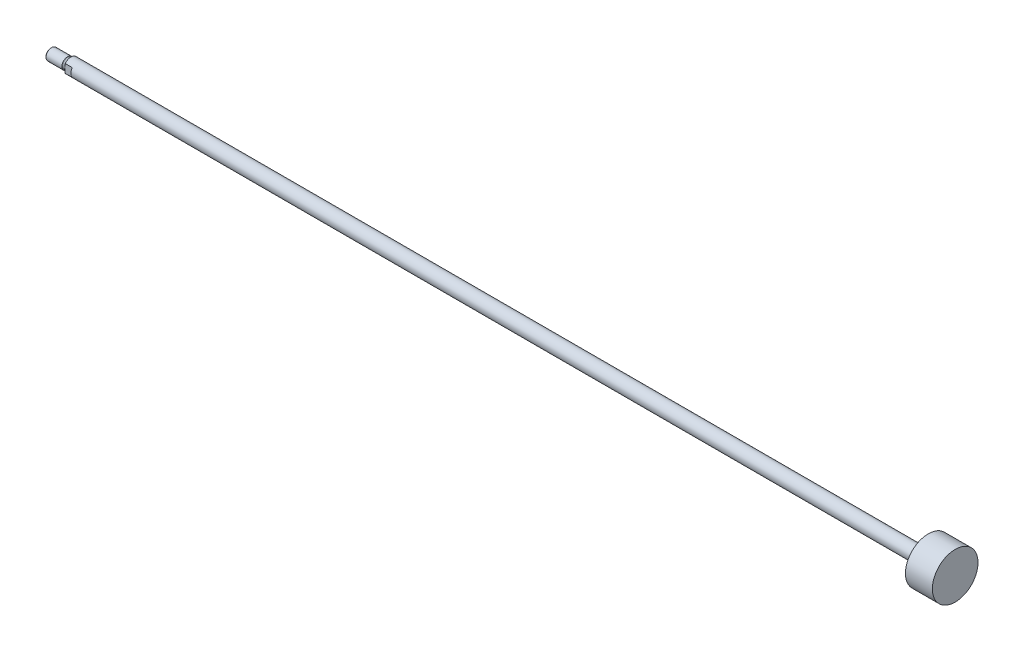
ISO-10303-21;
HEADER;
FILE_DESCRIPTION(('STEP AP214'),'2;1');
FILE_NAME('part.step','',(''),(''),'','','');
FILE_SCHEMA(('AUTOMOTIVE_DESIGN { 1 0 10303 214 1 1 1 1 }'));
ENDSEC;
DATA;
#1=APPLICATION_CONTEXT('core data for automotive mechanical design processes');
#2=APPLICATION_PROTOCOL_DEFINITION('international standard','automotive_design',2000,#1);
#3=PRODUCT_CONTEXT('',#1,'mechanical');
#4=PRODUCT('Part','Part','',(#3));
#5=PRODUCT_RELATED_PRODUCT_CATEGORY('part','',(#4));
#6=PRODUCT_DEFINITION_FORMATION('','',#4);
#7=PRODUCT_DEFINITION_CONTEXT('part definition',#1,'design');
#8=PRODUCT_DEFINITION('design','',#6,#7);
#9=PRODUCT_DEFINITION_SHAPE('','',#8);
#10=(LENGTH_UNIT() NAMED_UNIT(*) SI_UNIT(.MILLI.,.METRE.));
#11=(NAMED_UNIT(*) PLANE_ANGLE_UNIT() SI_UNIT($,.RADIAN.));
#12=(NAMED_UNIT(*) SI_UNIT($,.STERADIAN.) SOLID_ANGLE_UNIT());
#13=UNCERTAINTY_MEASURE_WITH_UNIT(LENGTH_MEASURE(1.E-05),#10,'distance_accuracy_value','');
#14=(GEOMETRIC_REPRESENTATION_CONTEXT(3) GLOBAL_UNCERTAINTY_ASSIGNED_CONTEXT((#13)) GLOBAL_UNIT_ASSIGNED_CONTEXT((#10,
#11,#12)) REPRESENTATION_CONTEXT('',''));
#15=CARTESIAN_POINT('',(0.,0.,0.));
#16=DIRECTION('',(0.,0.,1.));
#17=DIRECTION('',(1.,0.,0.));
#18=AXIS2_PLACEMENT_3D('',#15,#16,#17);
#19=CARTESIAN_POINT('',(-504.7615,0.,0.));
#20=DIRECTION('',(1.,0.,0.));
#21=DIRECTION('',(0.,0.,-1.));
#22=AXIS2_PLACEMENT_3D('',#19,#20,#21);
#23=PLANE('',#22);
#24=CARTESIAN_POINT('',(-504.761500000029,0.,0.));
#25=DIRECTION('',(1.,0.,0.));
#26=DIRECTION('',(0.,0.,-1.));
#27=AXIS2_PLACEMENT_3D('',#24,#25,#26);
#28=CIRCLE('',#27,5.59435000008079);
#29=CARTESIAN_POINT('',(-504.761500000029,0.,-5.59435000008079));
#30=VERTEX_POINT('',#29);
#31=EDGE_CURVE('E19',#30,#30,#28,.T.);
#32=ORIENTED_EDGE('',*,*,#31,.F.);
#33=EDGE_LOOP('',(#32));
#34=FACE_BOUND('',#33,.T.);
#35=ADVANCED_FACE('F16',(#34),#23,.F.);
#36=CARTESIAN_POINT('',(-504.005850000055,0.,0.));
#37=DIRECTION('',(1.,0.,0.));
#38=DIRECTION('',(0.,0.,-1.));
#39=AXIS2_PLACEMENT_3D('',#36,#37,#38);
#40=CONICAL_SURFACE('',#39,6.35000000005448,0.785398163397448);
#41=ORIENTED_EDGE('',*,*,#31,.T.);
#42=EDGE_LOOP('',(#41));
#43=FACE_BOUND('',#42,.T.);
#44=CARTESIAN_POINT('',(-504.00585,0.,0.));
#45=DIRECTION('',(-1.,0.,0.));
#46=DIRECTION('',(0.,0.,1.));
#47=AXIS2_PLACEMENT_3D('',#44,#45,#46);
#48=CIRCLE('',#47,6.35);
#49=CARTESIAN_POINT('',(-504.00585,0.,6.35));
#50=VERTEX_POINT('',#49);
#51=EDGE_CURVE('E250',#50,#50,#48,.F.);
#52=ORIENTED_EDGE('',*,*,#51,.F.);
#53=EDGE_LOOP('',(#52));
#54=FACE_BOUND('',#53,.T.);
#55=ADVANCED_FACE('F171',(#43,#54),#40,.T.);
#56=CARTESIAN_POINT('',(-482.5365,0.,0.));
#57=DIRECTION('',(-1.,0.,0.));
#58=DIRECTION('',(0.,0.,1.));
#59=AXIS2_PLACEMENT_3D('',#56,#57,#58);
#60=CYLINDRICAL_SURFACE('',#59,6.35);
#61=ORIENTED_EDGE('',*,*,#51,.T.);
#62=EDGE_LOOP('',(#61));
#63=FACE_BOUND('',#62,.T.);
#64=CARTESIAN_POINT('',(-486.244899999974,0.,0.));
#65=DIRECTION('',(-1.,0.,0.));
#66=DIRECTION('',(0.,0.,1.));
#67=AXIS2_PLACEMENT_3D('',#64,#65,#66);
#68=CIRCLE('',#67,6.35000000005448);
#69=CARTESIAN_POINT('',(-486.244899999974,0.,6.35000000005448));
#70=VERTEX_POINT('',#69);
#71=EDGE_CURVE('E238',#70,#70,#68,.F.);
#72=ORIENTED_EDGE('',*,*,#71,.F.);
#73=EDGE_LOOP('',(#72));
#74=FACE_BOUND('',#73,.T.);
#75=ADVANCED_FACE('F168',(#63,#74),#60,.T.);
#76=CARTESIAN_POINT('',(-486.244899999974,0.,0.));
#77=DIRECTION('',(-1.,0.,0.));
#78=DIRECTION('',(0.,0.,1.));
#79=AXIS2_PLACEMENT_3D('',#76,#77,#78);
#80=CONICAL_SURFACE('',#79,6.35000000005448,0.785398163397448);
#81=CARTESIAN_POINT('',(-485.737866704261,0.,0.));
#82=DIRECTION('',(1.,0.,0.));
#83=DIRECTION('',(0.,0.,-1.));
#84=AXIS2_PLACEMENT_3D('',#81,#82,#83);
#85=CIRCLE('',#84,5.84296670426101);
#86=CARTESIAN_POINT('',(-485.737866704261,0.,-5.84296670426101));
#87=VERTEX_POINT('',#86);
#88=EDGE_CURVE('E155',#87,#87,#85,.F.);
#89=ORIENTED_EDGE('',*,*,#88,.T.);
#90=EDGE_LOOP('',(#89));
#91=FACE_BOUND('',#90,.T.);
#92=ORIENTED_EDGE('',*,*,#71,.T.);
#93=EDGE_LOOP('',(#92));
#94=FACE_BOUND('',#93,.T.);
#95=ADVANCED_FACE('F163',(#91,#94),#80,.T.);
#96=CARTESIAN_POINT('',(-484.570433408522,0.,0.));
#97=DIRECTION('',(1.,0.,0.));
#98=DIRECTION('',(0.,0.,-1.));
#99=AXIS2_PLACEMENT_3D('',#96,#97,#98);
#100=TOROIDAL_SURFACE('',#99,7.01040000000001,1.65100000000001);
#101=ORIENTED_EDGE('',*,*,#88,.F.);
#102=EDGE_LOOP('',(#101));
#103=FACE_BOUND('',#102,.T.);
#104=CARTESIAN_POINT('',(-484.570433408522,0.,0.));
#105=DIRECTION('',(-1.,0.,0.));
#106=DIRECTION('',(0.,0.,1.));
#107=AXIS2_PLACEMENT_3D('',#104,#105,#106);
#108=CIRCLE('',#107,5.3594);
#109=CARTESIAN_POINT('',(-484.570433408522,0.,5.3594));
#110=VERTEX_POINT('',#109);
#111=EDGE_CURVE('E231',#110,#110,#108,.F.);
#112=ORIENTED_EDGE('',*,*,#111,.F.);
#113=EDGE_LOOP('',(#112));
#114=FACE_BOUND('',#113,.T.);
#115=ADVANCED_FACE('F158',(#103,#114),#100,.F.);
#116=CARTESIAN_POINT('',(504.7615,25.52065,0.));
#117=DIRECTION('',(-1.,0.,0.));
#118=DIRECTION('',(0.,0.,1.));
#119=AXIS2_PLACEMENT_3D('',#116,#117,#118);
#120=PLANE('',#119);
#121=CARTESIAN_POINT('',(504.7615,0.,0.));
#122=DIRECTION('',(-1.,0.,0.));
#123=DIRECTION('',(0.,0.,1.));
#124=AXIS2_PLACEMENT_3D('',#121,#122,#123);
#125=CIRCLE('',#124,25.52065);
#126=CARTESIAN_POINT('',(504.7615,0.,25.52065));
#127=VERTEX_POINT('',#126);
#128=EDGE_CURVE('E229',#127,#127,#125,.T.);
#129=ORIENTED_EDGE('',*,*,#128,.F.);
#130=EDGE_LOOP('',(#129));
#131=FACE_BOUND('',#130,.T.);
#132=ADVANCED_FACE('F162',(#131),#120,.F.);
#133=CARTESIAN_POINT('',(-482.5365,0.,0.));
#134=DIRECTION('',(-1.,0.,0.));
#135=DIRECTION('',(0.,0.,1.));
#136=AXIS2_PLACEMENT_3D('',#133,#134,#135);
#137=CYLINDRICAL_SURFACE('',#136,5.3594);
#138=ORIENTED_EDGE('',*,*,#111,.T.);
#139=EDGE_LOOP('',(#138));
#140=FACE_BOUND('',#139,.T.);
#141=CARTESIAN_POINT('',(-484.1875,0.,0.));
#142=DIRECTION('',(1.,0.,0.));
#143=DIRECTION('',(0.,0.,-1.));
#144=AXIS2_PLACEMENT_3D('',#141,#142,#143);
#145=CIRCLE('',#144,5.3594);
#146=CARTESIAN_POINT('',(-484.1875,0.,-5.3594));
#147=VERTEX_POINT('',#146);
#148=EDGE_CURVE('E115',#147,#147,#145,.F.);
#149=ORIENTED_EDGE('',*,*,#148,.T.);
#150=EDGE_LOOP('',(#149));
#151=FACE_BOUND('',#150,.T.);
#152=ADVANCED_FACE('F266',(#140,#151),#137,.T.);
#153=CARTESIAN_POINT('',(504.7615,0.,0.));
#154=DIRECTION('',(-1.,0.,0.));
#155=DIRECTION('',(0.,0.,1.));
#156=AXIS2_PLACEMENT_3D('',#153,#154,#155);
#157=CYLINDRICAL_SURFACE('',#156,25.52065);
#158=CARTESIAN_POINT('',(474.7133,0.,0.));
#159=DIRECTION('',(-1.,0.,0.));
#160=DIRECTION('',(0.,0.,1.));
#161=AXIS2_PLACEMENT_3D('',#158,#159,#160);
#162=CIRCLE('',#161,25.52065);
#163=CARTESIAN_POINT('',(474.7133,0.,25.52065));
#164=VERTEX_POINT('',#163);
#165=EDGE_CURVE('E227',#164,#164,#162,.F.);
#166=ORIENTED_EDGE('',*,*,#165,.T.);
#167=EDGE_LOOP('',(#166));
#168=FACE_BOUND('',#167,.T.);
#169=ORIENTED_EDGE('',*,*,#128,.T.);
#170=EDGE_LOOP('',(#169));
#171=FACE_BOUND('',#170,.T.);
#172=ADVANCED_FACE('F264',(#168,#171),#157,.T.);
#173=CARTESIAN_POINT('',(-482.5365,0.,0.));
#174=DIRECTION('',(1.,0.,0.));
#175=DIRECTION('',(0.,0.,-1.));
#176=AXIS2_PLACEMENT_3D('',#173,#174,#175);
#177=PLANE('',#176);
#178=DIRECTION('',(0.,1.,0.));
#179=VECTOR('',#178,1.);
#180=CARTESIAN_POINT('',(-482.5365,7.9375,6.35));
#181=LINE('',#180,#179);
#182=CARTESIAN_POINT('',(-482.5365,2.97038855370808,6.35));
#183=VERTEX_POINT('',#182);
#184=CARTESIAN_POINT('',(-482.5365,4.7625,6.35));
#185=VERTEX_POINT('',#184);
#186=EDGE_CURVE('E91',#183,#185,#181,.T.);
#187=ORIENTED_EDGE('',*,*,#186,.T.);
#188=CARTESIAN_POINT('',(-482.5365,0.,0.));
#189=DIRECTION('',(-1.,0.,0.));
#190=DIRECTION('',(0.,0.,1.));
#191=AXIS2_PLACEMENT_3D('',#188,#189,#190);
#192=CIRCLE('',#191,7.9375);
#193=CARTESIAN_POINT('',(-482.5365,4.7625,-6.35));
#194=VERTEX_POINT('',#193);
#195=EDGE_CURVE('E61',#194,#185,#192,.F.);
#196=ORIENTED_EDGE('',*,*,#195,.F.);
#197=DIRECTION('',(0.,1.,0.));
#198=VECTOR('',#197,1.);
#199=CARTESIAN_POINT('',(-482.5365,-7.9375,-6.35));
#200=LINE('',#199,#198);
#201=CARTESIAN_POINT('',(-482.5365,2.97038855370802,-6.35));
#202=VERTEX_POINT('',#201);
#203=EDGE_CURVE('E83',#194,#202,#200,.F.);
#204=ORIENTED_EDGE('',*,*,#203,.T.);
#205=CARTESIAN_POINT('',(-482.5365,0.,0.));
#206=DIRECTION('',(-1.,0.,0.));
#207=DIRECTION('',(0.,0.423711707421557,0.905797101449276));
#208=AXIS2_PLACEMENT_3D('',#205,#206,#207);
#209=CIRCLE('',#208,7.01039999999997);
#210=EDGE_CURVE('E78',#202,#183,#209,.F.);
#211=ORIENTED_EDGE('',*,*,#210,.T.);
#212=EDGE_LOOP('',(#187,#196,#204,#211));
#213=FACE_BOUND('',#212,.T.);
#214=ADVANCED_FACE('F123',(#213),#177,.F.);
#215=CARTESIAN_POINT('',(-484.1875,0.,0.));
#216=DIRECTION('',(1.,0.,0.));
#217=DIRECTION('',(0.,0.,-1.));
#218=AXIS2_PLACEMENT_3D('',#215,#216,#217);
#219=TOROIDAL_SURFACE('',#218,7.0104,1.651);
#220=ORIENTED_EDGE('',*,*,#148,.F.);
#221=EDGE_LOOP('',(#220));
#222=FACE_BOUND('',#221,.T.);
#223=CARTESIAN_POINT('',(-482.5365,2.97038855370802,-6.35));
#224=CARTESIAN_POINT('',(-482.536504327173,2.87856001304067,-6.35));
#225=CARTESIAN_POINT('',(-482.537874664819,2.78674691580267,-6.35));
#226=CARTESIAN_POINT('',(-482.542756942646,2.60320136632234,-6.35));
#227=CARTESIAN_POINT('',(-482.546268277205,2.51146889861822,-6.35));
#228=CARTESIAN_POINT('',(-482.55914417215,2.23608737385471,-6.35));
#229=CARTESIAN_POINT('',(-482.570846736701,2.05255650770519,-6.35));
#230=CARTESIAN_POINT('',(-482.596116966028,1.68545441374016,-6.35));
#231=CARTESIAN_POINT('',(-482.609686550957,1.5018833411798,-6.35));
#232=CARTESIAN_POINT('',(-482.634685201551,1.13501829903269,-6.35));
#233=CARTESIAN_POINT('',(-482.64611933357,0.951724723885843,-6.35));
#234=CARTESIAN_POINT('',(-482.659367871152,0.67668446403584,-6.35));
#235=CARTESIAN_POINT('',(-482.663132676424,0.585034676844278,-6.35));
#236=CARTESIAN_POINT('',(-482.669116875887,0.401685560228341,-6.35));
#237=CARTESIAN_POINT('',(-482.671336302322,0.309986231877576,-6.35));
#238=CARTESIAN_POINT('',(-482.674067166751,0.126630244568479,-6.35));
#239=CARTESIAN_POINT('',(-482.674579884744,0.0349736052032447,-6.35));
#240=CARTESIAN_POINT('',(-482.673866383285,-0.148332071725435,-6.35));
#241=CARTESIAN_POINT('',(-482.67264017346,-0.239981109328154,-6.35000000000002));
#242=CARTESIAN_POINT('',(-482.668123536195,-0.441500345888281,-6.35000000000002));
#243=CARTESIAN_POINT('',(-482.664470473671,-0.551362349618982,-6.35));
#244=CARTESIAN_POINT('',(-482.655147204339,-0.77105878642087,-6.34999999999999));
#245=CARTESIAN_POINT('',(-482.64947587423,-0.880893169984662,-6.35));
#246=CARTESIAN_POINT('',(-482.636682654633,-1.10053620189391,-6.35));
#247=CARTESIAN_POINT('',(-482.629559956697,-1.21034480159827,-6.35));
#248=CARTESIAN_POINT('',(-482.614580541909,-1.42994756441092,-6.35));
#249=CARTESIAN_POINT('',(-482.606723576471,-1.539741709936,-6.35));
#250=CARTESIAN_POINT('',(-482.591081783682,-1.75953919720966,-6.35));
#251=CARTESIAN_POINT('',(-482.583297116149,-1.86954255122615,-6.35));
#252=CARTESIAN_POINT('',(-482.568709390859,-2.08957585527723,-6.35));
#253=CARTESIAN_POINT('',(-482.561905976962,-2.19960578107056,-6.35));
#254=CARTESIAN_POINT('',(-482.550218370566,-2.41972206498444,-6.35));
#255=CARTESIAN_POINT('',(-482.545333228605,-2.52980836811446,-6.35));
#256=CARTESIAN_POINT('',(-482.538479650548,-2.75004901434375,-6.35));
#257=CARTESIAN_POINT('',(-482.536510730201,-2.86020334310725,-6.35));
#258=CARTESIAN_POINT('',(-482.5365,-2.97038855370808,-6.35));
#259=B_SPLINE_CURVE_WITH_KNOTS('',3,(#223,#224,#225,#226,#227,#228,#229,#230,#231,#232,#233,
#234,#235,#236,#237,#238,#239,#240,#241,#242,#243,#244,#245,#246,#247,#248,#249,#250,#251,#252,
#253,#254,#255,#256,#257,#258),.UNSPECIFIED.,.F.,.F.,(4,2,2,2,2,2,2,2,2,2,2,2,2,2,2,2,2,4),(0.,
0.275453824117413,0.550829766971967,1.10248801480418,1.65471792159179,2.20562054264099,
2.48079023089341,2.75595417767492,3.03091171012023,3.30586772040325,3.63561237057658,
3.96554083351516,4.2956535797129,4.62587849341642,4.95671259976353,5.28742632811415,
5.61797616036995,5.94847109733862),.UNSPECIFIED.);
#260=CARTESIAN_POINT('',(-482.5365,-2.97038855370808,-6.34999999999999));
#261=VERTEX_POINT('',#260);
#262=EDGE_CURVE('E76',#202,#261,#259,.T.);
#263=ORIENTED_EDGE('',*,*,#262,.T.);
#264=CARTESIAN_POINT('',(-482.5365,0.,0.));
#265=DIRECTION('',(-1.,0.,0.));
#266=DIRECTION('',(0.,-0.423711707421557,-0.905797101449275));
#267=AXIS2_PLACEMENT_3D('',#264,#265,#266);
#268=CIRCLE('',#267,7.01039999999997);
#269=CARTESIAN_POINT('',(-482.5365,-2.97038855370801,6.35));
#270=VERTEX_POINT('',#269);
#271=EDGE_CURVE('E69',#261,#270,#268,.T.);
#272=ORIENTED_EDGE('',*,*,#271,.T.);
#273=CARTESIAN_POINT('',(-482.5365,-2.97038855370802,6.35));
#274=CARTESIAN_POINT('',(-482.536504327173,-2.87856001304067,6.35));
#275=CARTESIAN_POINT('',(-482.537874664819,-2.78674691580267,6.35));
#276=CARTESIAN_POINT('',(-482.542756942646,-2.60320136632234,6.35));
#277=CARTESIAN_POINT('',(-482.546268277205,-2.51146889861822,6.35));
#278=CARTESIAN_POINT('',(-482.55914417215,-2.2360873738547,6.35));
#279=CARTESIAN_POINT('',(-482.570846736701,-2.05255650770519,6.35));
#280=CARTESIAN_POINT('',(-482.596116966028,-1.68545441374016,6.35));
#281=CARTESIAN_POINT('',(-482.609686550957,-1.5018833411798,6.35));
#282=CARTESIAN_POINT('',(-482.634685201551,-1.13501829903269,6.35));
#283=CARTESIAN_POINT('',(-482.64611933357,-0.951724723885843,6.35));
#284=CARTESIAN_POINT('',(-482.659367871152,-0.676684464035841,6.35));
#285=CARTESIAN_POINT('',(-482.663132676424,-0.585034676844278,6.35));
#286=CARTESIAN_POINT('',(-482.669116875887,-0.401685560228341,6.35));
#287=CARTESIAN_POINT('',(-482.671336302322,-0.309986231877576,6.35));
#288=CARTESIAN_POINT('',(-482.674067166751,-0.12663024456848,6.35));
#289=CARTESIAN_POINT('',(-482.674579884744,-0.0349736052032453,6.35));
#290=CARTESIAN_POINT('',(-482.673866383285,0.148332071725434,6.35));
#291=CARTESIAN_POINT('',(-482.67264017346,0.239981109328154,6.35000000000002));
#292=CARTESIAN_POINT('',(-482.668123536195,0.441500345888281,6.35000000000002));
#293=CARTESIAN_POINT('',(-482.664470473671,0.551362349618982,6.35));
#294=CARTESIAN_POINT('',(-482.655147204339,0.771058786420869,6.34999999999999));
#295=CARTESIAN_POINT('',(-482.64947587423,0.880893169984661,6.35));
#296=CARTESIAN_POINT('',(-482.636682654633,1.10053620189391,6.35));
#297=CARTESIAN_POINT('',(-482.629559956697,1.21034480159827,6.35));
#298=CARTESIAN_POINT('',(-482.614580541909,1.42994756441092,6.35));
#299=CARTESIAN_POINT('',(-482.606723576471,1.539741709936,6.35));
#300=CARTESIAN_POINT('',(-482.591081783682,1.75953919720966,6.35));
#301=CARTESIAN_POINT('',(-482.583297116149,1.86954255122616,6.35));
#302=CARTESIAN_POINT('',(-482.568709390859,2.08957585527723,6.35));
#303=CARTESIAN_POINT('',(-482.561905976962,2.19960578107056,6.35));
#304=CARTESIAN_POINT('',(-482.550218370566,2.41972206498444,6.35));
#305=CARTESIAN_POINT('',(-482.545333228605,2.52980836811446,6.35));
#306=CARTESIAN_POINT('',(-482.538479650548,2.75004901434375,6.35));
#307=CARTESIAN_POINT('',(-482.536510730201,2.86020334310725,6.35));
#308=CARTESIAN_POINT('',(-482.5365,2.97038855370808,6.35));
#309=B_SPLINE_CURVE_WITH_KNOTS('',3,(#273,#274,#275,#276,#277,#278,#279,#280,#281,#282,#283,
#284,#285,#286,#287,#288,#289,#290,#291,#292,#293,#294,#295,#296,#297,#298,#299,#300,#301,#302,
#303,#304,#305,#306,#307,#308),.UNSPECIFIED.,.F.,.F.,(4,2,2,2,2,2,2,2,2,2,2,2,2,2,2,2,2,4),(0.,
0.275453824117413,0.550829766971967,1.10248801480418,1.65471792159179,2.20562054264099,
2.48079023089341,2.75595417767491,3.03091171012023,3.30586772040325,3.63561237057658,
3.96554083351516,4.2956535797129,4.62587849341642,4.95671259976353,5.28742632811415,
5.61797616036995,5.94847109733863),.UNSPECIFIED.);
#310=EDGE_CURVE('E216',#270,#183,#309,.T.);
#311=ORIENTED_EDGE('',*,*,#310,.T.);
#312=ORIENTED_EDGE('',*,*,#210,.F.);
#313=EDGE_LOOP('',(#263,#272,#311,#312));
#314=FACE_BOUND('',#313,.T.);
#315=ADVANCED_FACE('F77',(#222,#314),#219,.F.);
#316=CARTESIAN_POINT('',(474.7133,7.9375,0.));
#317=DIRECTION('',(1.,0.,0.));
#318=DIRECTION('',(0.,0.,-1.));
#319=AXIS2_PLACEMENT_3D('',#316,#317,#318);
#320=PLANE('',#319);
#321=CARTESIAN_POINT('',(474.7133,0.,0.));
#322=DIRECTION('',(-1.,0.,0.));
#323=DIRECTION('',(0.,0.,1.));
#324=AXIS2_PLACEMENT_3D('',#321,#322,#323);
#325=CIRCLE('',#324,7.9375);
#326=CARTESIAN_POINT('',(474.7133,0.,7.9375));
#327=VERTEX_POINT('',#326);
#328=EDGE_CURVE('E98',#327,#327,#325,.T.);
#329=ORIENTED_EDGE('',*,*,#328,.F.);
#330=EDGE_LOOP('',(#329));
#331=FACE_BOUND('',#330,.T.);
#332=ORIENTED_EDGE('',*,*,#165,.F.);
#333=EDGE_LOOP('',(#332));
#334=FACE_BOUND('',#333,.T.);
#335=ADVANCED_FACE('F122',(#331,#334),#320,.F.);
#336=CARTESIAN_POINT('',(-474.6625,0.,0.));
#337=DIRECTION('',(1.,0.,0.));
#338=DIRECTION('',(0.,0.,-1.));
#339=AXIS2_PLACEMENT_3D('',#336,#337,#338);
#340=PLANE('',#339);
#341=CARTESIAN_POINT('',(-474.6625,0.,0.));
#342=DIRECTION('',(-1.,0.,0.));
#343=DIRECTION('',(0.,0.,1.));
#344=AXIS2_PLACEMENT_3D('',#341,#342,#343);
#345=CIRCLE('',#344,7.9375);
#346=CARTESIAN_POINT('',(-474.6625,4.7625,6.35));
#347=VERTEX_POINT('',#346);
#348=CARTESIAN_POINT('',(-474.6625,-4.7625,6.35));
#349=VERTEX_POINT('',#348);
#350=EDGE_CURVE('E215',#347,#349,#345,.F.);
#351=ORIENTED_EDGE('',*,*,#350,.F.);
#352=DIRECTION('',(0.,1.,0.));
#353=VECTOR('',#352,1.);
#354=CARTESIAN_POINT('',(-474.6625,7.9375,6.35));
#355=LINE('',#354,#353);
#356=EDGE_CURVE('E111',#347,#349,#355,.F.);
#357=ORIENTED_EDGE('',*,*,#356,.T.);
#358=EDGE_LOOP('',(#351,#357));
#359=FACE_BOUND('',#358,.T.);
#360=ADVANCED_FACE('F245',(#359),#340,.F.);
#361=CARTESIAN_POINT('',(-474.6625,7.9375,6.35));
#362=DIRECTION('',(0.,0.,-1.));
#363=DIRECTION('',(-1.,0.,0.));
#364=AXIS2_PLACEMENT_3D('',#361,#362,#363);
#365=PLANE('',#364);
#366=ORIENTED_EDGE('',*,*,#310,.F.);
#367=DIRECTION('',(0.,1.,0.));
#368=VECTOR('',#367,1.);
#369=CARTESIAN_POINT('',(-482.5365,0.,6.35));
#370=LINE('',#369,#368);
#371=CARTESIAN_POINT('',(-482.5365,-4.7625,6.35));
#372=VERTEX_POINT('',#371);
#373=EDGE_CURVE('E90',#270,#372,#370,.F.);
#374=ORIENTED_EDGE('',*,*,#373,.T.);
#375=DIRECTION('',(-1.,0.,0.));
#376=VECTOR('',#375,1.);
#377=CARTESIAN_POINT('',(504.7615,-4.7625,6.35));
#378=LINE('',#377,#376);
#379=EDGE_CURVE('E211',#349,#372,#378,.T.);
#380=ORIENTED_EDGE('',*,*,#379,.F.);
#381=ORIENTED_EDGE('',*,*,#356,.F.);
#382=DIRECTION('',(-1.,0.,0.));
#383=VECTOR('',#382,1.);
#384=CARTESIAN_POINT('',(-474.6625,4.7625,6.35));
#385=LINE('',#384,#383);
#386=EDGE_CURVE('E220',#185,#347,#385,.F.);
#387=ORIENTED_EDGE('',*,*,#386,.F.);
#388=ORIENTED_EDGE('',*,*,#186,.F.);
#389=EDGE_LOOP('',(#366,#374,#380,#381,#387,#388));
#390=FACE_BOUND('',#389,.T.);
#391=ADVANCED_FACE('F199',(#390),#365,.F.);
#392=CARTESIAN_POINT('',(-482.5365,0.,0.));
#393=DIRECTION('',(1.,0.,0.));
#394=DIRECTION('',(0.,0.,-1.));
#395=AXIS2_PLACEMENT_3D('',#392,#393,#394);
#396=PLANE('',#395);
#397=ORIENTED_EDGE('',*,*,#373,.F.);
#398=ORIENTED_EDGE('',*,*,#271,.F.);
#399=DIRECTION('',(0.,1.,0.));
#400=VECTOR('',#399,1.);
#401=CARTESIAN_POINT('',(-482.5365,-7.9375,-6.35));
#402=LINE('',#401,#400);
#403=CARTESIAN_POINT('',(-482.5365,-4.7625,-6.35));
#404=VERTEX_POINT('',#403);
#405=EDGE_CURVE('E82',#261,#404,#402,.F.);
#406=ORIENTED_EDGE('',*,*,#405,.T.);
#407=CARTESIAN_POINT('',(-482.5365,0.,0.));
#408=DIRECTION('',(-1.,0.,0.));
#409=DIRECTION('',(0.,0.,1.));
#410=AXIS2_PLACEMENT_3D('',#407,#408,#409);
#411=CIRCLE('',#410,7.9375);
#412=EDGE_CURVE('E214',#372,#404,#411,.F.);
#413=ORIENTED_EDGE('',*,*,#412,.F.);
#414=EDGE_LOOP('',(#397,#398,#406,#413));
#415=FACE_BOUND('',#414,.T.);
#416=ADVANCED_FACE('F88',(#415),#396,.F.);
#417=CARTESIAN_POINT('',(-474.6625,-7.9375,-6.35));
#418=DIRECTION('',(0.,0.,1.));
#419=DIRECTION('',(1.,0.,0.));
#420=AXIS2_PLACEMENT_3D('',#417,#418,#419);
#421=PLANE('',#420);
#422=ORIENTED_EDGE('',*,*,#262,.F.);
#423=ORIENTED_EDGE('',*,*,#203,.F.);
#424=DIRECTION('',(1.,0.,0.));
#425=VECTOR('',#424,1.);
#426=CARTESIAN_POINT('',(-474.6625,4.7625,-6.35));
#427=LINE('',#426,#425);
#428=CARTESIAN_POINT('',(-474.6625,4.7625,-6.35));
#429=VERTEX_POINT('',#428);
#430=EDGE_CURVE('E104',#429,#194,#427,.F.);
#431=ORIENTED_EDGE('',*,*,#430,.F.);
#432=DIRECTION('',(0.,1.,0.));
#433=VECTOR('',#432,1.);
#434=CARTESIAN_POINT('',(-474.6625,0.,-6.35));
#435=LINE('',#434,#433);
#436=CARTESIAN_POINT('',(-474.6625,-4.7625,-6.35));
#437=VERTEX_POINT('',#436);
#438=EDGE_CURVE('E34',#429,#437,#435,.F.);
#439=ORIENTED_EDGE('',*,*,#438,.T.);
#440=DIRECTION('',(-1.,0.,0.));
#441=VECTOR('',#440,1.);
#442=CARTESIAN_POINT('',(504.7615,-4.7625,-6.35));
#443=LINE('',#442,#441);
#444=EDGE_CURVE('E25',#404,#437,#443,.F.);
#445=ORIENTED_EDGE('',*,*,#444,.F.);
#446=ORIENTED_EDGE('',*,*,#405,.F.);
#447=EDGE_LOOP('',(#422,#423,#431,#439,#445,#446));
#448=FACE_BOUND('',#447,.T.);
#449=ADVANCED_FACE('F94',(#448),#421,.F.);
#450=CARTESIAN_POINT('',(-474.6625,0.,0.));
#451=DIRECTION('',(1.,0.,0.));
#452=DIRECTION('',(0.,0.,-1.));
#453=AXIS2_PLACEMENT_3D('',#450,#451,#452);
#454=PLANE('',#453);
#455=ORIENTED_EDGE('',*,*,#438,.F.);
#456=CARTESIAN_POINT('',(-474.6625,0.,0.));
#457=DIRECTION('',(-1.,0.,0.));
#458=DIRECTION('',(0.,0.,1.));
#459=AXIS2_PLACEMENT_3D('',#456,#457,#458);
#460=CIRCLE('',#459,7.9375);
#461=EDGE_CURVE('E10',#437,#429,#460,.F.);
#462=ORIENTED_EDGE('',*,*,#461,.F.);
#463=EDGE_LOOP('',(#455,#462));
#464=FACE_BOUND('',#463,.T.);
#465=ADVANCED_FACE('F184',(#464),#454,.F.);
#466=CARTESIAN_POINT('',(504.7615,0.,0.));
#467=DIRECTION('',(-1.,0.,0.));
#468=DIRECTION('',(0.,0.,1.));
#469=AXIS2_PLACEMENT_3D('',#466,#467,#468);
#470=CYLINDRICAL_SURFACE('',#469,7.9375);
#471=ORIENTED_EDGE('',*,*,#328,.T.);
#472=EDGE_LOOP('',(#471));
#473=FACE_BOUND('',#472,.T.);
#474=ORIENTED_EDGE('',*,*,#444,.T.);
#475=ORIENTED_EDGE('',*,*,#461,.T.);
#476=ORIENTED_EDGE('',*,*,#430,.T.);
#477=ORIENTED_EDGE('',*,*,#195,.T.);
#478=ORIENTED_EDGE('',*,*,#386,.T.);
#479=ORIENTED_EDGE('',*,*,#350,.T.);
#480=ORIENTED_EDGE('',*,*,#379,.T.);
#481=ORIENTED_EDGE('',*,*,#412,.T.);
#482=EDGE_LOOP('',(#474,#475,#476,#477,#478,#479,#480,#481));
#483=FACE_BOUND('',#482,.T.);
#484=ADVANCED_FACE('F182',(#473,#483),#470,.T.);
#485=CLOSED_SHELL('',(#35,#55,#75,#95,#115,#132,#152,#172,#214,#315,#335,#360,#391,#416,#449,
#465,#484));
#486=MANIFOLD_SOLID_BREP('B1',#485);
#487=ADVANCED_BREP_SHAPE_REPRESENTATION('',(#18,#486),#14);
#488=SHAPE_DEFINITION_REPRESENTATION(#9,#487);
ENDSEC;
END-ISO-10303-21;
